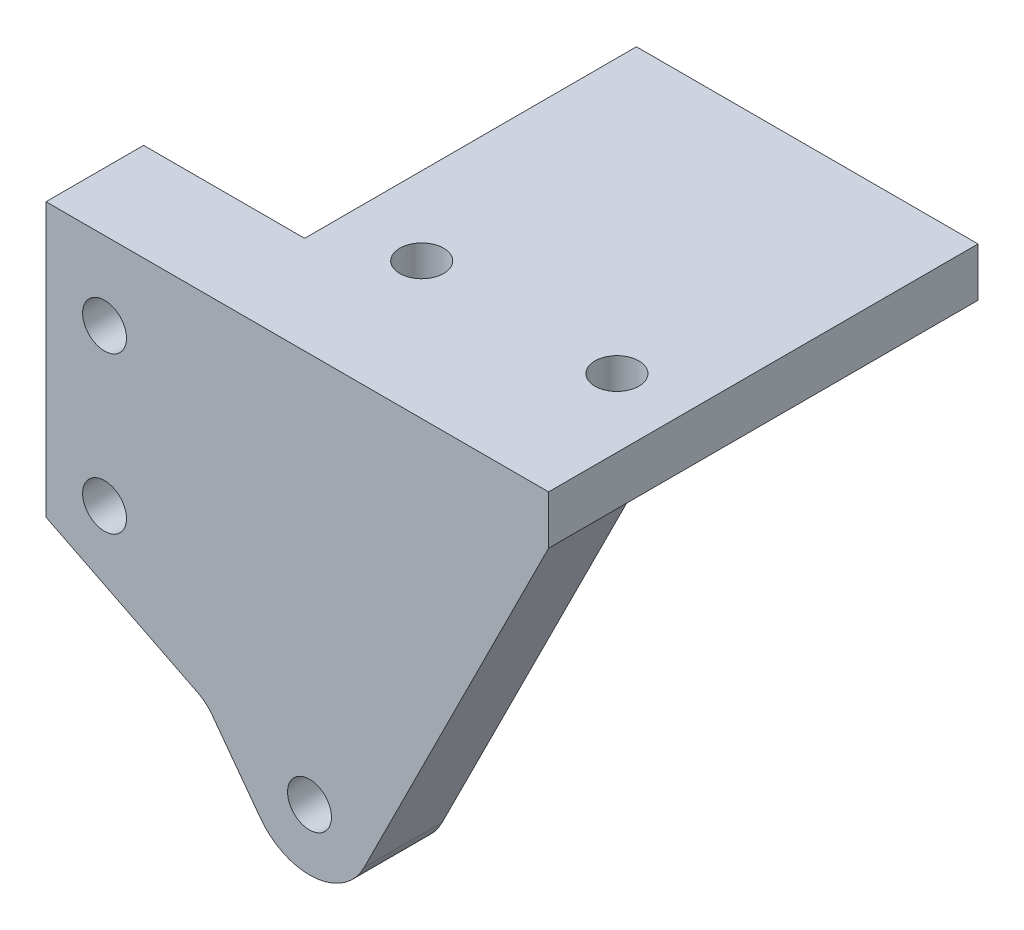
ISO-10303-21;
HEADER;
FILE_DESCRIPTION(('STEP AP214'),'2;1');
FILE_NAME('part.step','',(''),(''),'','','');
FILE_SCHEMA(('AUTOMOTIVE_DESIGN { 1 0 10303 214 1 1 1 1 }'));
ENDSEC;
DATA;
#1=APPLICATION_CONTEXT('core data for automotive mechanical design processes');
#2=APPLICATION_PROTOCOL_DEFINITION('international standard','automotive_design',2000,#1);
#3=PRODUCT_CONTEXT('',#1,'mechanical');
#4=PRODUCT('Part','Part','',(#3));
#5=PRODUCT_RELATED_PRODUCT_CATEGORY('part','',(#4));
#6=PRODUCT_DEFINITION_FORMATION('','',#4);
#7=PRODUCT_DEFINITION_CONTEXT('part definition',#1,'design');
#8=PRODUCT_DEFINITION('design','',#6,#7);
#9=PRODUCT_DEFINITION_SHAPE('','',#8);
#10=(LENGTH_UNIT() NAMED_UNIT(*) SI_UNIT(.MILLI.,.METRE.));
#11=(NAMED_UNIT(*) PLANE_ANGLE_UNIT() SI_UNIT($,.RADIAN.));
#12=(NAMED_UNIT(*) SI_UNIT($,.STERADIAN.) SOLID_ANGLE_UNIT());
#13=UNCERTAINTY_MEASURE_WITH_UNIT(LENGTH_MEASURE(1.E-05),#10,'distance_accuracy_value','');
#14=(GEOMETRIC_REPRESENTATION_CONTEXT(3) GLOBAL_UNCERTAINTY_ASSIGNED_CONTEXT((#13)) GLOBAL_UNIT_ASSIGNED_CONTEXT((#10,
#11,#12)) REPRESENTATION_CONTEXT('',''));
#15=CARTESIAN_POINT('',(0.,0.,0.));
#16=DIRECTION('',(0.,0.,1.));
#17=DIRECTION('',(1.,0.,0.));
#18=AXIS2_PLACEMENT_3D('',#15,#16,#17);
#19=CARTESIAN_POINT('',(0.,28.,0.));
#20=DIRECTION('',(-1.,0.,0.));
#21=DIRECTION('',(0.,0.,1.));
#22=AXIS2_PLACEMENT_3D('',#19,#20,#21);
#23=PLANE('',#22);
#24=CARTESIAN_POINT('',(0.,17.5,-34.));
#25=DIRECTION('',(1.,0.,0.));
#26=DIRECTION('',(0.,0.,-1.));
#27=AXIS2_PLACEMENT_3D('',#24,#25,#26);
#28=CIRCLE('',#27,2.25);
#29=CARTESIAN_POINT('',(0.,17.5,-36.25));
#30=VERTEX_POINT('',#29);
#31=EDGE_CURVE('E269',#30,#30,#28,.T.);
#32=ORIENTED_EDGE('',*,*,#31,.F.);
#33=EDGE_LOOP('',(#32));
#34=FACE_BOUND('',#33,.T.);
#35=DIRECTION('',(0.,-1.,0.));
#36=VECTOR('',#35,1.);
#37=CARTESIAN_POINT('',(0.,23.,-8.));
#38=LINE('',#37,#36);
#39=CARTESIAN_POINT('',(0.,23.,-8.));
#40=VERTEX_POINT('',#39);
#41=CARTESIAN_POINT('',(0.,0.,-8.));
#42=VERTEX_POINT('',#41);
#43=EDGE_CURVE('E330',#40,#42,#38,.T.);
#44=ORIENTED_EDGE('',*,*,#43,.T.);
#45=DIRECTION('',(0.,0.,-1.));
#46=VECTOR('',#45,1.);
#47=CARTESIAN_POINT('',(0.,0.,0.));
#48=LINE('',#47,#46);
#49=CARTESIAN_POINT('',(0.,0.,-40.));
#50=VERTEX_POINT('',#49);
#51=EDGE_CURVE('E302',#42,#50,#48,.T.);
#52=ORIENTED_EDGE('',*,*,#51,.T.);
#53=DIRECTION('',(0.,-1.,0.));
#54=VECTOR('',#53,1.);
#55=CARTESIAN_POINT('',(0.,28.,-40.));
#56=LINE('',#55,#54);
#57=CARTESIAN_POINT('',(0.,23.,-40.));
#58=VERTEX_POINT('',#57);
#59=EDGE_CURVE('E281',#58,#50,#56,.T.);
#60=ORIENTED_EDGE('',*,*,#59,.F.);
#61=DIRECTION('',(0.,0.,-1.));
#62=VECTOR('',#61,1.);
#63=CARTESIAN_POINT('',(0.,23.,0.));
#64=LINE('',#63,#62);
#65=CARTESIAN_POINT('',(0.,23.,-17.5));
#66=VERTEX_POINT('',#65);
#67=EDGE_CURVE('E254',#66,#58,#64,.T.);
#68=ORIENTED_EDGE('',*,*,#67,.F.);
#69=DIRECTION('',(0.,1.,0.));
#70=VECTOR('',#69,1.);
#71=CARTESIAN_POINT('',(0.,23.,-17.5));
#72=LINE('',#71,#70);
#73=CARTESIAN_POINT('',(0.,18.,-17.5));
#74=VERTEX_POINT('',#73);
#75=EDGE_CURVE('E214',#74,#66,#72,.T.);
#76=ORIENTED_EDGE('',*,*,#75,.F.);
#77=DIRECTION('',(0.,0.,-1.));
#78=VECTOR('',#77,1.);
#79=CARTESIAN_POINT('',(0.,18.,-10.5));
#80=LINE('',#79,#78);
#81=CARTESIAN_POINT('',(0.,18.,-15.0307764064044));
#82=VERTEX_POINT('',#81);
#83=EDGE_CURVE('E225',#82,#74,#80,.T.);
#84=ORIENTED_EDGE('',*,*,#83,.F.);
#85=DIRECTION('',(0.,-1.,0.));
#86=VECTOR('',#85,1.);
#87=CARTESIAN_POINT('',(0.,28.00005,-15.0307764064044));
#88=LINE('',#87,#86);
#89=CARTESIAN_POINT('',(0.,13.,-15.0307764064044));
#90=VERTEX_POINT('',#89);
#91=EDGE_CURVE('E249',#82,#90,#88,.T.);
#92=ORIENTED_EDGE('',*,*,#91,.T.);
#93=DIRECTION('',(0.,0.,1.));
#94=VECTOR('',#93,1.);
#95=CARTESIAN_POINT('',(0.,13.,0.));
#96=LINE('',#95,#94);
#97=CARTESIAN_POINT('',(0.,13.,-12.9692235935956));
#98=VERTEX_POINT('',#97);
#99=EDGE_CURVE('E41',#90,#98,#96,.T.);
#100=ORIENTED_EDGE('',*,*,#99,.T.);
#101=DIRECTION('',(0.,-1.,0.));
#102=VECTOR('',#101,1.);
#103=CARTESIAN_POINT('',(0.,28.00005,-12.9692235935956));
#104=LINE('',#103,#102);
#105=CARTESIAN_POINT('',(0.,18.,-12.9692235935956));
#106=VERTEX_POINT('',#105);
#107=EDGE_CURVE('E246',#98,#106,#104,.F.);
#108=ORIENTED_EDGE('',*,*,#107,.T.);
#109=CARTESIAN_POINT('',(0.,18.,-10.5));
#110=VERTEX_POINT('',#109);
#111=EDGE_CURVE('E227',#110,#106,#80,.T.);
#112=ORIENTED_EDGE('',*,*,#111,.F.);
#113=DIRECTION('',(0.,-1.,0.));
#114=VECTOR('',#113,1.);
#115=CARTESIAN_POINT('',(0.,23.,-10.5));
#116=LINE('',#115,#114);
#117=CARTESIAN_POINT('',(0.,23.,-10.5));
#118=VERTEX_POINT('',#117);
#119=EDGE_CURVE('E222',#118,#110,#116,.T.);
#120=ORIENTED_EDGE('',*,*,#119,.F.);
#121=EDGE_CURVE('E259',#40,#118,#64,.T.);
#122=ORIENTED_EDGE('',*,*,#121,.F.);
#123=EDGE_LOOP('',(#44,#52,#60,#68,#76,#84,#92,#100,#108,#112,#120,#122));
#124=FACE_BOUND('',#123,.T.);
#125=ADVANCED_FACE('F33',(#34,#124),#23,.F.);
#126=CARTESIAN_POINT('',(0.,0.,0.));
#127=DIRECTION('',(0.,1.,0.));
#128=DIRECTION('',(0.,0.,1.));
#129=AXIS2_PLACEMENT_3D('',#126,#127,#128);
#130=PLANE('',#129);
#131=DIRECTION('',(-1.,0.,0.));
#132=VECTOR('',#131,1.);
#133=CARTESIAN_POINT('',(0.,0.,-8.));
#134=LINE('',#133,#132);
#135=CARTESIAN_POINT('',(-26.5,0.,-8.));
#136=VERTEX_POINT('',#135);
#137=EDGE_CURVE('E325',#42,#136,#134,.T.);
#138=ORIENTED_EDGE('',*,*,#137,.T.);
#139=DIRECTION('',(0.,0.,1.));
#140=VECTOR('',#139,1.);
#141=CARTESIAN_POINT('',(-26.5,0.,0.));
#142=LINE('',#141,#140);
#143=CARTESIAN_POINT('',(-26.5,0.,-10.));
#144=VERTEX_POINT('',#143);
#145=EDGE_CURVE('E201',#144,#136,#142,.T.);
#146=ORIENTED_EDGE('',*,*,#145,.F.);
#147=DIRECTION('',(-1.,0.,0.));
#148=VECTOR('',#147,1.);
#149=CARTESIAN_POINT('',(-26.5,0.,-10.));
#150=LINE('',#149,#148);
#151=CARTESIAN_POINT('',(-10.,0.,-10.));
#152=VERTEX_POINT('',#151);
#153=EDGE_CURVE('E307',#152,#144,#150,.T.);
#154=ORIENTED_EDGE('',*,*,#153,.F.);
#155=DIRECTION('',(0.,0.,1.));
#156=VECTOR('',#155,1.);
#157=CARTESIAN_POINT('',(-10.,0.,-40.));
#158=LINE('',#157,#156);
#159=CARTESIAN_POINT('',(-10.,0.,-44.));
#160=VERTEX_POINT('',#159);
#161=EDGE_CURVE('E304',#160,#152,#158,.T.);
#162=ORIENTED_EDGE('',*,*,#161,.F.);
#163=DIRECTION('',(-1.,0.,0.));
#164=VECTOR('',#163,1.);
#165=CARTESIAN_POINT('',(0.,0.,-44.));
#166=LINE('',#165,#164);
#167=CARTESIAN_POINT('',(0.,0.,-44.));
#168=VERTEX_POINT('',#167);
#169=EDGE_CURVE('E387',#168,#160,#166,.T.);
#170=ORIENTED_EDGE('',*,*,#169,.F.);
#171=DIRECTION('',(0.,0.,1.));
#172=VECTOR('',#171,1.);
#173=CARTESIAN_POINT('',(0.,0.,-44.));
#174=LINE('',#173,#172);
#175=EDGE_CURVE('E383',#168,#50,#174,.T.);
#176=ORIENTED_EDGE('',*,*,#175,.T.);
#177=ORIENTED_EDGE('',*,*,#51,.F.);
#178=EDGE_LOOP('',(#138,#146,#154,#162,#170,#176,#177));
#179=FACE_BOUND('',#178,.T.);
#180=ADVANCED_FACE('F321',(#179),#130,.F.);
#181=CARTESIAN_POINT('',(25.,23.,0.));
#182=DIRECTION('',(0.,1.,0.));
#183=DIRECTION('',(0.,0.,1.));
#184=AXIS2_PLACEMENT_3D('',#181,#182,#183);
#185=PLANE('',#184);
#186=CARTESIAN_POINT('',(-2.,23.,-14.));
#187=DIRECTION('',(0.,1.,0.));
#188=DIRECTION('',(0.,0.,1.));
#189=AXIS2_PLACEMENT_3D('',#186,#187,#188);
#190=CIRCLE('',#189,2.25);
#191=CARTESIAN_POINT('',(-2.,23.,-11.75));
#192=VERTEX_POINT('',#191);
#193=EDGE_CURVE('E278',#192,#192,#190,.T.);
#194=ORIENTED_EDGE('',*,*,#193,.T.);
#195=EDGE_LOOP('',(#194));
#196=FACE_BOUND('',#195,.T.);
#197=CARTESIAN_POINT('',(18.,23.,-14.));
#198=DIRECTION('',(0.,1.,0.));
#199=DIRECTION('',(0.,0.,1.));
#200=AXIS2_PLACEMENT_3D('',#197,#198,#199);
#201=CIRCLE('',#200,2.25);
#202=CARTESIAN_POINT('',(18.,23.,-11.75));
#203=VERTEX_POINT('',#202);
#204=EDGE_CURVE('E234',#203,#203,#201,.T.);
#205=ORIENTED_EDGE('',*,*,#204,.T.);
#206=EDGE_LOOP('',(#205));
#207=FACE_BOUND('',#206,.T.);
#208=DIRECTION('',(-1.,0.,0.));
#209=VECTOR('',#208,1.);
#210=CARTESIAN_POINT('',(25.,23.,-8.));
#211=LINE('',#210,#209);
#212=CARTESIAN_POINT('',(25.,23.,-8.));
#213=VERTEX_POINT('',#212);
#214=EDGE_CURVE('E334',#213,#40,#211,.T.);
#215=ORIENTED_EDGE('',*,*,#214,.T.);
#216=ORIENTED_EDGE('',*,*,#121,.T.);
#217=DIRECTION('',(1.,0.,0.));
#218=VECTOR('',#217,1.);
#219=CARTESIAN_POINT('',(-10.,23.,-10.5));
#220=LINE('',#219,#218);
#221=CARTESIAN_POINT('',(-10.,23.,-10.5));
#222=VERTEX_POINT('',#221);
#223=EDGE_CURVE('E231',#222,#118,#220,.T.);
#224=ORIENTED_EDGE('',*,*,#223,.F.);
#225=DIRECTION('',(0.,0.,1.));
#226=VECTOR('',#225,1.);
#227=CARTESIAN_POINT('',(-10.,23.,-10.5));
#228=LINE('',#227,#226);
#229=CARTESIAN_POINT('',(-10.,23.,-17.5));
#230=VERTEX_POINT('',#229);
#231=EDGE_CURVE('E218',#230,#222,#228,.T.);
#232=ORIENTED_EDGE('',*,*,#231,.F.);
#233=DIRECTION('',(1.,0.,0.));
#234=VECTOR('',#233,1.);
#235=CARTESIAN_POINT('',(-10.,23.,-17.5));
#236=LINE('',#235,#234);
#237=EDGE_CURVE('E235',#230,#66,#236,.T.);
#238=ORIENTED_EDGE('',*,*,#237,.T.);
#239=ORIENTED_EDGE('',*,*,#67,.T.);
#240=DIRECTION('',(-1.,0.,0.));
#241=VECTOR('',#240,1.);
#242=CARTESIAN_POINT('',(25.,23.,-40.));
#243=LINE('',#242,#241);
#244=CARTESIAN_POINT('',(25.,23.,-40.));
#245=VERTEX_POINT('',#244);
#246=EDGE_CURVE('E266',#245,#58,#243,.T.);
#247=ORIENTED_EDGE('',*,*,#246,.F.);
#248=DIRECTION('',(0.,0.,-1.));
#249=VECTOR('',#248,1.);
#250=CARTESIAN_POINT('',(25.,23.,0.));
#251=LINE('',#250,#249);
#252=EDGE_CURVE('E258',#213,#245,#251,.T.);
#253=ORIENTED_EDGE('',*,*,#252,.F.);
#254=EDGE_LOOP('',(#215,#216,#224,#232,#238,#239,#247,#253));
#255=FACE_BOUND('',#254,.T.);
#256=ADVANCED_FACE('F405',(#196,#207,#255),#185,.F.);
#257=CARTESIAN_POINT('',(-2.,28.00005,-14.));
#258=DIRECTION('',(0.,-1.,0.));
#259=DIRECTION('',(0.,0.,-1.));
#260=AXIS2_PLACEMENT_3D('',#257,#258,#259);
#261=CYLINDRICAL_SURFACE('',#260,2.25);
#262=CARTESIAN_POINT('',(-2.,28.,-14.));
#263=DIRECTION('',(0.,1.,0.));
#264=DIRECTION('',(0.,0.,1.));
#265=AXIS2_PLACEMENT_3D('',#262,#263,#264);
#266=CIRCLE('',#265,2.25);
#267=CARTESIAN_POINT('',(-2.,28.,-11.75));
#268=VERTEX_POINT('',#267);
#269=EDGE_CURVE('E251',#268,#268,#266,.T.);
#270=ORIENTED_EDGE('',*,*,#269,.T.);
#271=EDGE_LOOP('',(#270));
#272=FACE_BOUND('',#271,.T.);
#273=ORIENTED_EDGE('',*,*,#193,.F.);
#274=EDGE_LOOP('',(#273));
#275=FACE_BOUND('',#274,.T.);
#276=ADVANCED_FACE('F475',(#272,#275),#261,.F.);
#277=CARTESIAN_POINT('',(-10.,28.,-40.));
#278=DIRECTION('',(1.,0.,0.));
#279=DIRECTION('',(0.,0.,-1.));
#280=AXIS2_PLACEMENT_3D('',#277,#278,#279);
#281=PLANE('',#280);
#282=ORIENTED_EDGE('',*,*,#231,.T.);
#283=DIRECTION('',(0.,-1.,0.));
#284=VECTOR('',#283,1.);
#285=CARTESIAN_POINT('',(-10.,23.,-10.5));
#286=LINE('',#285,#284);
#287=CARTESIAN_POINT('',(-10.,18.,-10.5));
#288=VERTEX_POINT('',#287);
#289=EDGE_CURVE('E210',#222,#288,#286,.T.);
#290=ORIENTED_EDGE('',*,*,#289,.T.);
#291=DIRECTION('',(0.,0.,-1.));
#292=VECTOR('',#291,1.);
#293=CARTESIAN_POINT('',(-10.,18.,-10.5));
#294=LINE('',#293,#292);
#295=CARTESIAN_POINT('',(-10.,18.,-17.5));
#296=VERTEX_POINT('',#295);
#297=EDGE_CURVE('E213',#288,#296,#294,.T.);
#298=ORIENTED_EDGE('',*,*,#297,.T.);
#299=DIRECTION('',(0.,1.,0.));
#300=VECTOR('',#299,1.);
#301=CARTESIAN_POINT('',(-10.,23.,-17.5));
#302=LINE('',#301,#300);
#303=EDGE_CURVE('E57',#296,#230,#302,.T.);
#304=ORIENTED_EDGE('',*,*,#303,.T.);
#305=EDGE_LOOP('',(#282,#290,#298,#304));
#306=FACE_BOUND('',#305,.T.);
#307=CARTESIAN_POINT('',(-10.,17.5,-34.));
#308=DIRECTION('',(1.,0.,0.));
#309=DIRECTION('',(0.,0.,-1.));
#310=AXIS2_PLACEMENT_3D('',#307,#308,#309);
#311=CIRCLE('',#310,2.25);
#312=CARTESIAN_POINT('',(-10.,17.5,-36.25));
#313=VERTEX_POINT('',#312);
#314=EDGE_CURVE('E290',#313,#313,#311,.T.);
#315=ORIENTED_EDGE('',*,*,#314,.T.);
#316=EDGE_LOOP('',(#315));
#317=FACE_BOUND('',#316,.T.);
#318=ORIENTED_EDGE('',*,*,#161,.T.);
#319=DIRECTION('',(0.,-1.,0.));
#320=VECTOR('',#319,1.);
#321=CARTESIAN_POINT('',(-10.,28.,-10.));
#322=LINE('',#321,#320);
#323=CARTESIAN_POINT('',(-10.,28.,-10.));
#324=VERTEX_POINT('',#323);
#325=EDGE_CURVE('E289',#324,#152,#322,.T.);
#326=ORIENTED_EDGE('',*,*,#325,.F.);
#327=DIRECTION('',(0.,0.,1.));
#328=VECTOR('',#327,1.);
#329=CARTESIAN_POINT('',(-10.,28.,-40.));
#330=LINE('',#329,#328);
#331=CARTESIAN_POINT('',(-10.,28.,-44.));
#332=VERTEX_POINT('',#331);
#333=EDGE_CURVE('E309',#332,#324,#330,.T.);
#334=ORIENTED_EDGE('',*,*,#333,.F.);
#335=DIRECTION('',(0.,1.,0.));
#336=VECTOR('',#335,1.);
#337=CARTESIAN_POINT('',(-10.,0.,-44.));
#338=LINE('',#337,#336);
#339=EDGE_CURVE('E382',#160,#332,#338,.T.);
#340=ORIENTED_EDGE('',*,*,#339,.F.);
#341=EDGE_LOOP('',(#318,#326,#334,#340));
#342=FACE_BOUND('',#341,.T.);
#343=ADVANCED_FACE('F416',(#306,#317,#342),#281,.F.);
#344=CARTESIAN_POINT('',(-26.5,28.,-10.));
#345=DIRECTION('',(0.,0.,1.));
#346=DIRECTION('',(1.,0.,0.));
#347=AXIS2_PLACEMENT_3D('',#344,#345,#346);
#348=PLANE('',#347);
#349=CARTESIAN_POINT('',(-20.5,4.,-10.));
#350=DIRECTION('',(0.,0.,1.));
#351=DIRECTION('',(1.,0.,0.));
#352=AXIS2_PLACEMENT_3D('',#349,#350,#351);
#353=CIRCLE('',#352,2.25);
#354=CARTESIAN_POINT('',(-18.25,4.,-10.));
#355=VERTEX_POINT('',#354);
#356=EDGE_CURVE('E466',#355,#355,#353,.T.);
#357=ORIENTED_EDGE('',*,*,#356,.T.);
#358=EDGE_LOOP('',(#357));
#359=FACE_BOUND('',#358,.T.);
#360=CARTESIAN_POINT('',(-20.5,20.,-10.));
#361=DIRECTION('',(0.,0.,1.));
#362=DIRECTION('',(1.,0.,0.));
#363=AXIS2_PLACEMENT_3D('',#360,#361,#362);
#364=CIRCLE('',#363,2.25);
#365=CARTESIAN_POINT('',(-18.25,20.,-10.));
#366=VERTEX_POINT('',#365);
#367=EDGE_CURVE('E305',#366,#366,#364,.T.);
#368=ORIENTED_EDGE('',*,*,#367,.T.);
#369=EDGE_LOOP('',(#368));
#370=FACE_BOUND('',#369,.T.);
#371=ORIENTED_EDGE('',*,*,#153,.T.);
#372=DIRECTION('',(0.,-1.,0.));
#373=VECTOR('',#372,1.);
#374=CARTESIAN_POINT('',(-26.5,28.,-10.));
#375=LINE('',#374,#373);
#376=CARTESIAN_POINT('',(-26.5,28.,-10.));
#377=VERTEX_POINT('',#376);
#378=EDGE_CURVE('E296',#377,#144,#375,.T.);
#379=ORIENTED_EDGE('',*,*,#378,.F.);
#380=DIRECTION('',(-1.,0.,0.));
#381=VECTOR('',#380,1.);
#382=CARTESIAN_POINT('',(-26.5,28.,-10.));
#383=LINE('',#382,#381);
#384=EDGE_CURVE('E317',#324,#377,#383,.T.);
#385=ORIENTED_EDGE('',*,*,#384,.F.);
#386=ORIENTED_EDGE('',*,*,#325,.T.);
#387=EDGE_LOOP('',(#371,#379,#385,#386));
#388=FACE_BOUND('',#387,.T.);
#389=ADVANCED_FACE('F316',(#359,#370,#388),#348,.F.);
#390=CARTESIAN_POINT('',(-26.5,28.,0.));
#391=DIRECTION('',(1.,0.,0.));
#392=DIRECTION('',(0.,0.,-1.));
#393=AXIS2_PLACEMENT_3D('',#390,#391,#392);
#394=PLANE('',#393);
#395=DIRECTION('',(0.,0.,1.));
#396=VECTOR('',#395,1.);
#397=CARTESIAN_POINT('',(-26.5,0.,-8.));
#398=LINE('',#397,#396);
#399=CARTESIAN_POINT('',(-26.5,0.,0.));
#400=VERTEX_POINT('',#399);
#401=EDGE_CURVE('E190',#136,#400,#398,.T.);
#402=ORIENTED_EDGE('',*,*,#401,.T.);
#403=DIRECTION('',(0.,1.,0.));
#404=VECTOR('',#403,1.);
#405=CARTESIAN_POINT('',(-26.5,28.,0.));
#406=LINE('',#405,#404);
#407=CARTESIAN_POINT('',(-26.5,28.,0.));
#408=VERTEX_POINT('',#407);
#409=EDGE_CURVE('E172',#400,#408,#406,.T.);
#410=ORIENTED_EDGE('',*,*,#409,.T.);
#411=DIRECTION('',(0.,0.,1.));
#412=VECTOR('',#411,1.);
#413=CARTESIAN_POINT('',(-26.5,28.,0.));
#414=LINE('',#413,#412);
#415=EDGE_CURVE('E297',#377,#408,#414,.T.);
#416=ORIENTED_EDGE('',*,*,#415,.F.);
#417=ORIENTED_EDGE('',*,*,#378,.T.);
#418=ORIENTED_EDGE('',*,*,#145,.T.);
#419=EDGE_LOOP('',(#402,#410,#416,#417,#418));
#420=FACE_BOUND('',#419,.T.);
#421=ADVANCED_FACE('F198',(#420),#394,.F.);
#422=CARTESIAN_POINT('',(0.,28.,0.));
#423=DIRECTION('',(0.,0.,-1.));
#424=DIRECTION('',(-1.,0.,0.));
#425=AXIS2_PLACEMENT_3D('',#422,#423,#424);
#426=PLANE('',#425);
#427=ORIENTED_EDGE('',*,*,#409,.F.);
#428=DIRECTION('',(0.894062707627854,-0.447941820808406,0.));
#429=VECTOR('',#428,1.);
#430=CARTESIAN_POINT('',(-26.5,0.,0.));
#431=LINE('',#430,#429);
#432=CARTESIAN_POINT('',(-10.9224930112807,-7.80461681786982,0.));
#433=VERTEX_POINT('',#432);
#434=EDGE_CURVE('E177',#400,#433,#431,.T.);
#435=ORIENTED_EDGE('',*,*,#434,.T.);
#436=CARTESIAN_POINT('',(-12.7142602945144,-11.3808676483812,0.));
#437=DIRECTION('',(0.,0.,-1.));
#438=DIRECTION('',(-1.,0.,0.));
#439=AXIS2_PLACEMENT_3D('',#436,#437,#438);
#440=CIRCLE('',#439,4.);
#441=CARTESIAN_POINT('',(-9.49999999999999,-9.,0.));
#442=VERTEX_POINT('',#441);
#443=EDGE_CURVE('E194',#433,#442,#440,.T.);
#444=ORIENTED_EDGE('',*,*,#443,.T.);
#445=DIRECTION('',(0.595216912095308,-0.803565073628593,0.));
#446=VECTOR('',#445,1.);
#447=CARTESIAN_POINT('',(-9.49999999999999,-9.,0.));
#448=LINE('',#447,#446);
#449=CARTESIAN_POINT('',(-4.5222817101787,-15.7201057005957,0.));
#450=VERTEX_POINT('',#449);
#451=EDGE_CURVE('E349',#442,#450,#448,.T.);
#452=ORIENTED_EDGE('',*,*,#451,.T.);
#453=CARTESIAN_POINT('',(0.500000000000007,-12.,0.));
#454=DIRECTION('',(0.,0.,1.));
#455=DIRECTION('',(1.,0.,0.));
#456=AXIS2_PLACEMENT_3D('',#453,#454,#455);
#457=CIRCLE('',#456,6.25);
#458=CARTESIAN_POINT('',(6.08944289459122,-14.7965385976424,0.));
#459=VERTEX_POINT('',#458);
#460=EDGE_CURVE('E342',#450,#459,#457,.T.);
#461=ORIENTED_EDGE('',*,*,#460,.T.);
#462=DIRECTION('',(0.447446175622787,0.894310863134594,0.));
#463=VECTOR('',#462,1.);
#464=CARTESIAN_POINT('',(6.08944289459122,-14.7965385976424,0.));
#465=LINE('',#464,#463);
#466=CARTESIAN_POINT('',(25.,23.,0.));
#467=VERTEX_POINT('',#466);
#468=EDGE_CURVE('E195',#459,#467,#465,.T.);
#469=ORIENTED_EDGE('',*,*,#468,.T.);
#470=DIRECTION('',(0.,-1.,0.));
#471=VECTOR('',#470,1.);
#472=CARTESIAN_POINT('',(25.,28.,0.));
#473=LINE('',#472,#471);
#474=CARTESIAN_POINT('',(25.,28.,0.));
#475=VERTEX_POINT('',#474);
#476=EDGE_CURVE('E255',#475,#467,#473,.T.);
#477=ORIENTED_EDGE('',*,*,#476,.F.);
#478=DIRECTION('',(1.,0.,0.));
#479=VECTOR('',#478,1.);
#480=CARTESIAN_POINT('',(0.,28.,0.));
#481=LINE('',#480,#479);
#482=EDGE_CURVE('E179',#408,#475,#481,.T.);
#483=ORIENTED_EDGE('',*,*,#482,.F.);
#484=EDGE_LOOP('',(#427,#435,#444,#452,#461,#469,#477,#483));
#485=FACE_BOUND('',#484,.T.);
#486=CARTESIAN_POINT('',(0.500000000000006,-12.,0.));
#487=DIRECTION('',(0.,0.,1.));
#488=DIRECTION('',(1.,0.,0.));
#489=AXIS2_PLACEMENT_3D('',#486,#487,#488);
#490=CIRCLE('',#489,2.25);
#491=CARTESIAN_POINT('',(2.75000000000001,-12.,0.));
#492=VERTEX_POINT('',#491);
#493=EDGE_CURVE('E395',#492,#492,#490,.T.);
#494=ORIENTED_EDGE('',*,*,#493,.F.);
#495=EDGE_LOOP('',(#494));
#496=FACE_BOUND('',#495,.T.);
#497=CARTESIAN_POINT('',(-20.5,20.,0.));
#498=DIRECTION('',(0.,0.,-1.));
#499=DIRECTION('',(-1.,0.,0.));
#500=AXIS2_PLACEMENT_3D('',#497,#498,#499);
#501=CIRCLE('',#500,2.25);
#502=CARTESIAN_POINT('',(-18.25,20.,0.));
#503=VERTEX_POINT('',#502);
#504=EDGE_CURVE('E185',#503,#503,#501,.F.);
#505=ORIENTED_EDGE('',*,*,#504,.F.);
#506=EDGE_LOOP('',(#505));
#507=FACE_BOUND('',#506,.T.);
#508=CARTESIAN_POINT('',(-20.5,4.,0.));
#509=DIRECTION('',(0.,0.,-1.));
#510=DIRECTION('',(-1.,0.,0.));
#511=AXIS2_PLACEMENT_3D('',#508,#509,#510);
#512=CIRCLE('',#511,2.25);
#513=CARTESIAN_POINT('',(-18.25,4.,0.));
#514=VERTEX_POINT('',#513);
#515=EDGE_CURVE('E36',#514,#514,#512,.F.);
#516=ORIENTED_EDGE('',*,*,#515,.F.);
#517=EDGE_LOOP('',(#516));
#518=FACE_BOUND('',#517,.T.);
#519=ADVANCED_FACE('F174',(#485,#496,#507,#518),#426,.F.);
#520=CARTESIAN_POINT('',(0.,28.,0.));
#521=DIRECTION('',(0.,1.,0.));
#522=DIRECTION('',(0.,0.,1.));
#523=AXIS2_PLACEMENT_3D('',#520,#521,#522);
#524=PLANE('',#523);
#525=ORIENTED_EDGE('',*,*,#415,.T.);
#526=ORIENTED_EDGE('',*,*,#482,.T.);
#527=DIRECTION('',(0.,0.,1.));
#528=VECTOR('',#527,1.);
#529=CARTESIAN_POINT('',(25.,28.,0.));
#530=LINE('',#529,#528);
#531=CARTESIAN_POINT('',(25.,28.,-44.));
#532=VERTEX_POINT('',#531);
#533=EDGE_CURVE('E263',#532,#475,#530,.T.);
#534=ORIENTED_EDGE('',*,*,#533,.F.);
#535=DIRECTION('',(1.,0.,0.));
#536=VECTOR('',#535,1.);
#537=CARTESIAN_POINT('',(-10.,28.,-44.));
#538=LINE('',#537,#536);
#539=EDGE_CURVE('E377',#332,#532,#538,.T.);
#540=ORIENTED_EDGE('',*,*,#539,.F.);
#541=ORIENTED_EDGE('',*,*,#333,.T.);
#542=ORIENTED_EDGE('',*,*,#384,.T.);
#543=EDGE_LOOP('',(#525,#526,#534,#540,#541,#542));
#544=FACE_BOUND('',#543,.T.);
#545=CARTESIAN_POINT('',(18.,28.,-14.));
#546=DIRECTION('',(0.,1.,0.));
#547=DIRECTION('',(0.,0.,1.));
#548=AXIS2_PLACEMENT_3D('',#545,#546,#547);
#549=CIRCLE('',#548,2.25);
#550=CARTESIAN_POINT('',(18.,28.,-11.75));
#551=VERTEX_POINT('',#550);
#552=EDGE_CURVE('E240',#551,#551,#549,.T.);
#553=ORIENTED_EDGE('',*,*,#552,.F.);
#554=EDGE_LOOP('',(#553));
#555=FACE_BOUND('',#554,.T.);
#556=ORIENTED_EDGE('',*,*,#269,.F.);
#557=EDGE_LOOP('',(#556));
#558=FACE_BOUND('',#557,.T.);
#559=ADVANCED_FACE('F375',(#544,#555,#558),#524,.T.);
#560=CARTESIAN_POINT('',(-20.5,20.,-40.));
#561=DIRECTION('',(0.,0.,1.));
#562=DIRECTION('',(1.,0.,0.));
#563=AXIS2_PLACEMENT_3D('',#560,#561,#562);
#564=CYLINDRICAL_SURFACE('',#563,2.25);
#565=CARTESIAN_POINT('',(-18.25,20.,0.));
#566=CARTESIAN_POINT('',(-18.25,20.,-0.10416666666666));
#567=CARTESIAN_POINT('',(-18.25,20.,-0.208333333333327));
#568=CARTESIAN_POINT('',(-18.25,20.,-0.41666666666666));
#569=CARTESIAN_POINT('',(-18.25,20.,-0.520833333333327));
#570=CARTESIAN_POINT('',(-18.25,20.,-0.72916666666666));
#571=CARTESIAN_POINT('',(-18.25,20.,-0.833333333333327));
#572=CARTESIAN_POINT('',(-18.25,20.,-1.04166666666666));
#573=CARTESIAN_POINT('',(-18.25,20.,-1.14583333333333));
#574=CARTESIAN_POINT('',(-18.25,20.,-1.35416666666666));
#575=CARTESIAN_POINT('',(-18.25,20.,-1.45833333333333));
#576=CARTESIAN_POINT('',(-18.25,20.,-1.66666666666666));
#577=CARTESIAN_POINT('',(-18.25,20.,-1.77083333333333));
#578=CARTESIAN_POINT('',(-18.25,20.,-1.97916666666666));
#579=CARTESIAN_POINT('',(-18.25,20.,-2.08333333333333));
#580=CARTESIAN_POINT('',(-18.25,20.,-2.29166666666666));
#581=CARTESIAN_POINT('',(-18.25,20.,-2.39583333333333));
#582=CARTESIAN_POINT('',(-18.25,20.,-2.60416666666666));
#583=CARTESIAN_POINT('',(-18.25,20.,-2.70833333333333));
#584=CARTESIAN_POINT('',(-18.25,20.,-2.91666666666666));
#585=CARTESIAN_POINT('',(-18.25,20.,-3.02083333333333));
#586=CARTESIAN_POINT('',(-18.25,20.,-3.22916666666666));
#587=CARTESIAN_POINT('',(-18.25,20.,-3.33333333333333));
#588=CARTESIAN_POINT('',(-18.25,20.,-3.54166666666666));
#589=CARTESIAN_POINT('',(-18.25,20.,-3.64583333333333));
#590=CARTESIAN_POINT('',(-18.25,20.,-3.85416666666666));
#591=CARTESIAN_POINT('',(-18.25,20.,-3.95833333333333));
#592=CARTESIAN_POINT('',(-18.25,20.,-4.16666666666666));
#593=CARTESIAN_POINT('',(-18.25,20.,-4.27083333333333));
#594=CARTESIAN_POINT('',(-18.25,20.,-4.47916666666666));
#595=CARTESIAN_POINT('',(-18.25,20.,-4.58333333333333));
#596=CARTESIAN_POINT('',(-18.25,20.,-4.79166666666666));
#597=CARTESIAN_POINT('',(-18.25,20.,-4.89583333333333));
#598=CARTESIAN_POINT('',(-18.25,20.,-5.10416666666666));
#599=CARTESIAN_POINT('',(-18.25,20.,-5.20833333333333));
#600=CARTESIAN_POINT('',(-18.25,20.,-5.41666666666666));
#601=CARTESIAN_POINT('',(-18.25,20.,-5.52083333333333));
#602=CARTESIAN_POINT('',(-18.25,20.,-5.72916666666666));
#603=CARTESIAN_POINT('',(-18.25,20.,-5.83333333333333));
#604=CARTESIAN_POINT('',(-18.25,20.,-6.04166666666667));
#605=CARTESIAN_POINT('',(-18.25,20.,-6.14583333333333));
#606=CARTESIAN_POINT('',(-18.25,20.,-6.35416666666667));
#607=CARTESIAN_POINT('',(-18.25,20.,-6.45833333333333));
#608=CARTESIAN_POINT('',(-18.25,20.,-6.66666666666667));
#609=CARTESIAN_POINT('',(-18.25,20.,-6.77083333333333));
#610=CARTESIAN_POINT('',(-18.25,20.,-6.97916666666667));
#611=CARTESIAN_POINT('',(-18.25,20.,-7.08333333333333));
#612=CARTESIAN_POINT('',(-18.25,20.,-7.29166666666667));
#613=CARTESIAN_POINT('',(-18.25,20.,-7.39583333333333));
#614=CARTESIAN_POINT('',(-18.25,20.,-7.60416666666667));
#615=CARTESIAN_POINT('',(-18.25,20.,-7.70833333333333));
#616=CARTESIAN_POINT('',(-18.25,20.,-7.91666666666667));
#617=CARTESIAN_POINT('',(-18.25,20.,-8.02083333333333));
#618=CARTESIAN_POINT('',(-18.25,20.,-8.22916666666667));
#619=CARTESIAN_POINT('',(-18.25,20.,-8.33333333333333));
#620=CARTESIAN_POINT('',(-18.25,20.,-8.54166666666667));
#621=CARTESIAN_POINT('',(-18.25,20.,-8.64583333333333));
#622=CARTESIAN_POINT('',(-18.25,20.,-8.85416666666667));
#623=CARTESIAN_POINT('',(-18.25,20.,-8.95833333333333));
#624=CARTESIAN_POINT('',(-18.25,20.,-9.16666666666666));
#625=CARTESIAN_POINT('',(-18.25,20.,-9.27083333333333));
#626=CARTESIAN_POINT('',(-18.25,20.,-9.47916666666667));
#627=CARTESIAN_POINT('',(-18.25,20.,-9.58333333333333));
#628=CARTESIAN_POINT('',(-18.25,20.,-9.79166666666667));
#629=CARTESIAN_POINT('',(-18.25,20.,-9.89583333333333));
#630=CARTESIAN_POINT('',(-18.25,20.,-10.));
#631=B_SPLINE_CURVE_WITH_KNOTS('',3,(#565,#566,#567,#568,#569,#570,#571,#572,#573,#574,#575,
#576,#577,#578,#579,#580,#581,#582,#583,#584,#585,#586,#587,#588,#589,#590,#591,#592,#593,#594,
#595,#596,#597,#598,#599,#600,#601,#602,#603,#604,#605,#606,#607,#608,#609,#610,#611,#612,#613,
#614,#615,#616,#617,#618,#619,#620,#621,#622,#623,#624,#625,#626,#627,#628,#629,#630),
.UNSPECIFIED.,.F.,.F.,(4,2,2,2,2,2,2,2,2,2,2,2,2,2,2,2,2,2,2,2,2,2,2,2,2,2,2,2,2,2,2,2,4),(0.,
0.3125,0.625000000000001,0.937500000000001,1.25,1.5625,1.875,2.1875,2.5,2.8125,3.125,3.4375,
3.75,4.0625,4.375,4.6875,5.,5.3125,5.62500000000001,5.93750000000001,6.25000000000001,
6.56250000000001,6.87500000000001,7.18750000000001,7.50000000000001,7.81250000000001,
8.12500000000001,8.43750000000001,8.75000000000001,9.06250000000001,9.37500000000001,
9.68750000000001,10.),.UNSPECIFIED.);
#632=EDGE_CURVE('BSEAM451',#503,#366,#631,.T.);
#633=ORIENTED_EDGE('',*,*,#504,.T.);
#634=ORIENTED_EDGE('',*,*,#367,.F.);
#635=ORIENTED_EDGE('',*,*,#632,.T.);
#636=ORIENTED_EDGE('',*,*,#632,.F.);
#637=EDGE_LOOP('',(#633,#635,#634,#636));
#638=FACE_BOUND('',#637,.T.);
#639=ADVANCED_FACE('F451',(#638),#564,.F.);
#640=CARTESIAN_POINT('',(-20.5,4.,-40.));
#641=DIRECTION('',(0.,0.,1.));
#642=DIRECTION('',(1.,0.,0.));
#643=AXIS2_PLACEMENT_3D('',#640,#641,#642);
#644=CYLINDRICAL_SURFACE('',#643,2.25);
#645=CARTESIAN_POINT('',(-18.25,4.,0.));
#646=CARTESIAN_POINT('',(-18.25,4.,-0.10416666666666));
#647=CARTESIAN_POINT('',(-18.25,4.,-0.208333333333327));
#648=CARTESIAN_POINT('',(-18.25,4.,-0.41666666666666));
#649=CARTESIAN_POINT('',(-18.25,4.,-0.520833333333327));
#650=CARTESIAN_POINT('',(-18.25,4.,-0.72916666666666));
#651=CARTESIAN_POINT('',(-18.25,4.,-0.833333333333327));
#652=CARTESIAN_POINT('',(-18.25,4.,-1.04166666666666));
#653=CARTESIAN_POINT('',(-18.25,4.,-1.14583333333333));
#654=CARTESIAN_POINT('',(-18.25,4.,-1.35416666666666));
#655=CARTESIAN_POINT('',(-18.25,4.,-1.45833333333333));
#656=CARTESIAN_POINT('',(-18.25,4.,-1.66666666666666));
#657=CARTESIAN_POINT('',(-18.25,4.,-1.77083333333333));
#658=CARTESIAN_POINT('',(-18.25,4.,-1.97916666666666));
#659=CARTESIAN_POINT('',(-18.25,4.,-2.08333333333333));
#660=CARTESIAN_POINT('',(-18.25,4.,-2.29166666666666));
#661=CARTESIAN_POINT('',(-18.25,4.,-2.39583333333333));
#662=CARTESIAN_POINT('',(-18.25,4.,-2.60416666666666));
#663=CARTESIAN_POINT('',(-18.25,4.,-2.70833333333333));
#664=CARTESIAN_POINT('',(-18.25,4.,-2.91666666666666));
#665=CARTESIAN_POINT('',(-18.25,4.,-3.02083333333333));
#666=CARTESIAN_POINT('',(-18.25,4.,-3.22916666666666));
#667=CARTESIAN_POINT('',(-18.25,4.,-3.33333333333333));
#668=CARTESIAN_POINT('',(-18.25,4.,-3.54166666666666));
#669=CARTESIAN_POINT('',(-18.25,4.,-3.64583333333333));
#670=CARTESIAN_POINT('',(-18.25,4.,-3.85416666666666));
#671=CARTESIAN_POINT('',(-18.25,4.,-3.95833333333333));
#672=CARTESIAN_POINT('',(-18.25,4.,-4.16666666666666));
#673=CARTESIAN_POINT('',(-18.25,4.,-4.27083333333333));
#674=CARTESIAN_POINT('',(-18.25,4.,-4.47916666666666));
#675=CARTESIAN_POINT('',(-18.25,4.,-4.58333333333333));
#676=CARTESIAN_POINT('',(-18.25,4.,-4.79166666666666));
#677=CARTESIAN_POINT('',(-18.25,4.,-4.89583333333333));
#678=CARTESIAN_POINT('',(-18.25,4.,-5.10416666666666));
#679=CARTESIAN_POINT('',(-18.25,4.,-5.20833333333333));
#680=CARTESIAN_POINT('',(-18.25,4.,-5.41666666666666));
#681=CARTESIAN_POINT('',(-18.25,4.,-5.52083333333333));
#682=CARTESIAN_POINT('',(-18.25,4.,-5.72916666666666));
#683=CARTESIAN_POINT('',(-18.25,4.,-5.83333333333333));
#684=CARTESIAN_POINT('',(-18.25,4.,-6.04166666666667));
#685=CARTESIAN_POINT('',(-18.25,4.,-6.14583333333333));
#686=CARTESIAN_POINT('',(-18.25,4.,-6.35416666666667));
#687=CARTESIAN_POINT('',(-18.25,4.,-6.45833333333333));
#688=CARTESIAN_POINT('',(-18.25,4.,-6.66666666666667));
#689=CARTESIAN_POINT('',(-18.25,4.,-6.77083333333333));
#690=CARTESIAN_POINT('',(-18.25,4.,-6.97916666666667));
#691=CARTESIAN_POINT('',(-18.25,4.,-7.08333333333333));
#692=CARTESIAN_POINT('',(-18.25,4.,-7.29166666666667));
#693=CARTESIAN_POINT('',(-18.25,4.,-7.39583333333333));
#694=CARTESIAN_POINT('',(-18.25,4.,-7.60416666666667));
#695=CARTESIAN_POINT('',(-18.25,4.,-7.70833333333333));
#696=CARTESIAN_POINT('',(-18.25,4.,-7.91666666666667));
#697=CARTESIAN_POINT('',(-18.25,4.,-8.02083333333333));
#698=CARTESIAN_POINT('',(-18.25,4.,-8.22916666666667));
#699=CARTESIAN_POINT('',(-18.25,4.,-8.33333333333333));
#700=CARTESIAN_POINT('',(-18.25,4.,-8.54166666666667));
#701=CARTESIAN_POINT('',(-18.25,4.,-8.64583333333333));
#702=CARTESIAN_POINT('',(-18.25,4.,-8.85416666666667));
#703=CARTESIAN_POINT('',(-18.25,4.,-8.95833333333333));
#704=CARTESIAN_POINT('',(-18.25,4.,-9.16666666666666));
#705=CARTESIAN_POINT('',(-18.25,4.,-9.27083333333333));
#706=CARTESIAN_POINT('',(-18.25,4.,-9.47916666666667));
#707=CARTESIAN_POINT('',(-18.25,4.,-9.58333333333333));
#708=CARTESIAN_POINT('',(-18.25,4.,-9.79166666666667));
#709=CARTESIAN_POINT('',(-18.25,4.,-9.89583333333333));
#710=CARTESIAN_POINT('',(-18.25,4.,-10.));
#711=B_SPLINE_CURVE_WITH_KNOTS('',3,(#645,#646,#647,#648,#649,#650,#651,#652,#653,#654,#655,
#656,#657,#658,#659,#660,#661,#662,#663,#664,#665,#666,#667,#668,#669,#670,#671,#672,#673,#674,
#675,#676,#677,#678,#679,#680,#681,#682,#683,#684,#685,#686,#687,#688,#689,#690,#691,#692,#693,
#694,#695,#696,#697,#698,#699,#700,#701,#702,#703,#704,#705,#706,#707,#708,#709,#710),
.UNSPECIFIED.,.F.,.F.,(4,2,2,2,2,2,2,2,2,2,2,2,2,2,2,2,2,2,2,2,2,2,2,2,2,2,2,2,2,2,2,2,4),(0.,
0.3125,0.625000000000001,0.937500000000001,1.25,1.5625,1.875,2.1875,2.5,2.8125,3.125,3.4375,
3.75,4.0625,4.375,4.6875,5.,5.3125,5.62500000000001,5.93750000000001,6.25000000000001,
6.56250000000001,6.87500000000001,7.18750000000001,7.50000000000001,7.81250000000001,
8.12500000000001,8.43750000000001,8.75000000000001,9.06250000000001,9.37500000000001,
9.68750000000001,10.),.UNSPECIFIED.);
#712=EDGE_CURVE('BSEAM442',#514,#355,#711,.T.);
#713=ORIENTED_EDGE('',*,*,#515,.T.);
#714=ORIENTED_EDGE('',*,*,#356,.F.);
#715=ORIENTED_EDGE('',*,*,#712,.T.);
#716=ORIENTED_EDGE('',*,*,#712,.F.);
#717=EDGE_LOOP('',(#713,#715,#714,#716));
#718=FACE_BOUND('',#717,.T.);
#719=ADVANCED_FACE('F442',(#718),#644,.F.);
#720=CARTESIAN_POINT('',(-26.5,17.5,-34.));
#721=DIRECTION('',(1.,0.,0.));
#722=DIRECTION('',(0.,0.,-1.));
#723=AXIS2_PLACEMENT_3D('',#720,#721,#722);
#724=CYLINDRICAL_SURFACE('',#723,2.25);
#725=ORIENTED_EDGE('',*,*,#31,.T.);
#726=EDGE_LOOP('',(#725));
#727=FACE_BOUND('',#726,.T.);
#728=ORIENTED_EDGE('',*,*,#314,.F.);
#729=EDGE_LOOP('',(#728));
#730=FACE_BOUND('',#729,.T.);
#731=ADVANCED_FACE('F508',(#727,#730),#724,.F.);
#732=CARTESIAN_POINT('',(25.,0.,0.));
#733=DIRECTION('',(1.,0.,0.));
#734=DIRECTION('',(0.,0.,-1.));
#735=AXIS2_PLACEMENT_3D('',#732,#733,#734);
#736=PLANE('',#735);
#737=ORIENTED_EDGE('',*,*,#476,.T.);
#738=EDGE_CURVE('E260',#467,#213,#251,.T.);
#739=ORIENTED_EDGE('',*,*,#738,.T.);
#740=ORIENTED_EDGE('',*,*,#252,.T.);
#741=DIRECTION('',(0.,0.,1.));
#742=VECTOR('',#741,1.);
#743=CARTESIAN_POINT('',(25.,23.,-44.));
#744=LINE('',#743,#742);
#745=CARTESIAN_POINT('',(25.,23.,-44.));
#746=VERTEX_POINT('',#745);
#747=EDGE_CURVE('E385',#746,#245,#744,.T.);
#748=ORIENTED_EDGE('',*,*,#747,.F.);
#749=DIRECTION('',(0.,-1.,0.));
#750=VECTOR('',#749,1.);
#751=CARTESIAN_POINT('',(25.,28.,-44.));
#752=LINE('',#751,#750);
#753=EDGE_CURVE('E371',#532,#746,#752,.T.);
#754=ORIENTED_EDGE('',*,*,#753,.F.);
#755=ORIENTED_EDGE('',*,*,#533,.T.);
#756=EDGE_LOOP('',(#737,#739,#740,#748,#754,#755));
#757=FACE_BOUND('',#756,.T.);
#758=ADVANCED_FACE('F367',(#757),#736,.T.);
#759=CARTESIAN_POINT('',(-2.,13.,-14.));
#760=DIRECTION('',(0.,-1.,0.));
#761=DIRECTION('',(0.,0.,-1.));
#762=AXIS2_PLACEMENT_3D('',#759,#760,#761);
#763=PLANE('',#762);
#764=CARTESIAN_POINT('',(-2.,13.,-14.));
#765=DIRECTION('',(0.,-1.,0.));
#766=DIRECTION('',(0.,0.,-1.));
#767=AXIS2_PLACEMENT_3D('',#764,#765,#766);
#768=CIRCLE('',#767,2.25);
#769=EDGE_CURVE('E243',#98,#90,#768,.T.);
#770=ORIENTED_EDGE('',*,*,#769,.F.);
#771=ORIENTED_EDGE('',*,*,#99,.F.);
#772=EDGE_LOOP('',(#770,#771));
#773=FACE_BOUND('',#772,.T.);
#774=ADVANCED_FACE('F494',(#773),#763,.F.);
#775=ORIENTED_EDGE('',*,*,#91,.F.);
#776=CARTESIAN_POINT('',(-2.,18.,-14.));
#777=DIRECTION('',(0.,-1.,0.));
#778=DIRECTION('',(0.,0.,-1.));
#779=AXIS2_PLACEMENT_3D('',#776,#777,#778);
#780=CIRCLE('',#779,2.25);
#781=EDGE_CURVE('E11',#82,#106,#780,.F.);
#782=ORIENTED_EDGE('',*,*,#781,.T.);
#783=ORIENTED_EDGE('',*,*,#107,.F.);
#784=ORIENTED_EDGE('',*,*,#769,.T.);
#785=EDGE_LOOP('',(#775,#782,#783,#784));
#786=FACE_BOUND('',#785,.T.);
#787=ADVANCED_FACE('F483',(#786),#261,.F.);
#788=CARTESIAN_POINT('',(18.,28.00005,-14.));
#789=DIRECTION('',(0.,-1.,0.));
#790=DIRECTION('',(0.,0.,-1.));
#791=AXIS2_PLACEMENT_3D('',#788,#789,#790);
#792=CYLINDRICAL_SURFACE('',#791,2.25);
#793=ORIENTED_EDGE('',*,*,#552,.T.);
#794=EDGE_LOOP('',(#793));
#795=FACE_BOUND('',#794,.T.);
#796=ORIENTED_EDGE('',*,*,#204,.F.);
#797=EDGE_LOOP('',(#796));
#798=FACE_BOUND('',#797,.T.);
#799=ADVANCED_FACE('F493',(#795,#798),#792,.F.);
#800=CARTESIAN_POINT('',(-10.,18.,-10.5));
#801=DIRECTION('',(0.,-1.,0.));
#802=DIRECTION('',(0.,0.,-1.));
#803=AXIS2_PLACEMENT_3D('',#800,#801,#802);
#804=PLANE('',#803);
#805=ORIENTED_EDGE('',*,*,#83,.T.);
#806=DIRECTION('',(1.,0.,0.));
#807=VECTOR('',#806,1.);
#808=CARTESIAN_POINT('',(-10.,18.,-17.5));
#809=LINE('',#808,#807);
#810=EDGE_CURVE('E237',#296,#74,#809,.T.);
#811=ORIENTED_EDGE('',*,*,#810,.F.);
#812=ORIENTED_EDGE('',*,*,#297,.F.);
#813=DIRECTION('',(1.,0.,0.));
#814=VECTOR('',#813,1.);
#815=CARTESIAN_POINT('',(-10.,18.,-10.5));
#816=LINE('',#815,#814);
#817=EDGE_CURVE('E221',#288,#110,#816,.T.);
#818=ORIENTED_EDGE('',*,*,#817,.T.);
#819=ORIENTED_EDGE('',*,*,#111,.T.);
#820=ORIENTED_EDGE('',*,*,#781,.F.);
#821=EDGE_LOOP('',(#805,#811,#812,#818,#819,#820));
#822=FACE_BOUND('',#821,.T.);
#823=ADVANCED_FACE('F419',(#822),#804,.F.);
#824=CARTESIAN_POINT('',(-10.,23.,-10.5));
#825=DIRECTION('',(0.,0.,1.));
#826=DIRECTION('',(1.,0.,0.));
#827=AXIS2_PLACEMENT_3D('',#824,#825,#826);
#828=PLANE('',#827);
#829=ORIENTED_EDGE('',*,*,#119,.T.);
#830=ORIENTED_EDGE('',*,*,#817,.F.);
#831=ORIENTED_EDGE('',*,*,#289,.F.);
#832=ORIENTED_EDGE('',*,*,#223,.T.);
#833=EDGE_LOOP('',(#829,#830,#831,#832));
#834=FACE_BOUND('',#833,.T.);
#835=ADVANCED_FACE('F411',(#834),#828,.F.);
#836=CARTESIAN_POINT('',(-10.,23.,-17.5));
#837=DIRECTION('',(0.,0.,-1.));
#838=DIRECTION('',(-1.,0.,0.));
#839=AXIS2_PLACEMENT_3D('',#836,#837,#838);
#840=PLANE('',#839);
#841=ORIENTED_EDGE('',*,*,#75,.T.);
#842=ORIENTED_EDGE('',*,*,#237,.F.);
#843=ORIENTED_EDGE('',*,*,#303,.F.);
#844=ORIENTED_EDGE('',*,*,#810,.T.);
#845=EDGE_LOOP('',(#841,#842,#843,#844));
#846=FACE_BOUND('',#845,.T.);
#847=ADVANCED_FACE('F422',(#846),#840,.F.);
#848=CARTESIAN_POINT('',(0.500000000000007,-12.,-8.));
#849=DIRECTION('',(0.,0.,1.));
#850=DIRECTION('',(1.,0.,0.));
#851=AXIS2_PLACEMENT_3D('',#848,#849,#850);
#852=CYLINDRICAL_SURFACE('',#851,6.25);
#853=ORIENTED_EDGE('',*,*,#460,.F.);
#854=DIRECTION('',(0.,0.,1.));
#855=VECTOR('',#854,1.);
#856=CARTESIAN_POINT('',(-4.5222817101787,-15.7201057005957,-8.));
#857=LINE('',#856,#855);
#858=CARTESIAN_POINT('',(-4.5222817101787,-15.7201057005957,-8.));
#859=VERTEX_POINT('',#858);
#860=EDGE_CURVE('E226',#859,#450,#857,.T.);
#861=ORIENTED_EDGE('',*,*,#860,.F.);
#862=CARTESIAN_POINT('',(0.500000000000007,-12.,-8.));
#863=DIRECTION('',(0.,0.,1.));
#864=DIRECTION('',(1.,0.,0.));
#865=AXIS2_PLACEMENT_3D('',#862,#863,#864);
#866=CIRCLE('',#865,6.25);
#867=CARTESIAN_POINT('',(6.08944289459122,-14.7965385976424,-8.));
#868=VERTEX_POINT('',#867);
#869=EDGE_CURVE('E352',#859,#868,#866,.T.);
#870=ORIENTED_EDGE('',*,*,#869,.T.);
#871=DIRECTION('',(0.,0.,1.));
#872=VECTOR('',#871,1.);
#873=CARTESIAN_POINT('',(6.08944289459122,-14.7965385976424,-8.));
#874=LINE('',#873,#872);
#875=EDGE_CURVE('E202',#868,#459,#874,.T.);
#876=ORIENTED_EDGE('',*,*,#875,.T.);
#877=EDGE_LOOP('',(#853,#861,#870,#876));
#878=FACE_BOUND('',#877,.T.);
#879=ADVANCED_FACE('F364',(#878),#852,.T.);
#880=CARTESIAN_POINT('',(-9.49999999999999,-9.,-8.));
#881=DIRECTION('',(-0.803565073628593,-0.595216912095308,0.));
#882=DIRECTION('',(0.595216912095308,-0.803565073628593,0.));
#883=AXIS2_PLACEMENT_3D('',#880,#881,#882);
#884=PLANE('',#883);
#885=ORIENTED_EDGE('',*,*,#451,.F.);
#886=DIRECTION('',(0.,0.,1.));
#887=VECTOR('',#886,1.);
#888=CARTESIAN_POINT('',(-9.49999999999999,-9.,-8.));
#889=LINE('',#888,#887);
#890=CARTESIAN_POINT('',(-9.49999999999999,-9.,-8.));
#891=VERTEX_POINT('',#890);
#892=EDGE_CURVE('E204',#891,#442,#889,.T.);
#893=ORIENTED_EDGE('',*,*,#892,.F.);
#894=DIRECTION('',(0.595216912095308,-0.803565073628593,0.));
#895=VECTOR('',#894,1.);
#896=CARTESIAN_POINT('',(-9.49999999999999,-9.,-8.));
#897=LINE('',#896,#895);
#898=EDGE_CURVE('E206',#891,#859,#897,.T.);
#899=ORIENTED_EDGE('',*,*,#898,.T.);
#900=ORIENTED_EDGE('',*,*,#860,.T.);
#901=EDGE_LOOP('',(#885,#893,#899,#900));
#902=FACE_BOUND('',#901,.T.);
#903=ADVANCED_FACE('F359',(#902),#884,.T.);
#904=CARTESIAN_POINT('',(-12.7142602945144,-11.3808676483812,-8.));
#905=DIRECTION('',(0.,0.,1.));
#906=DIRECTION('',(1.,0.,0.));
#907=AXIS2_PLACEMENT_3D('',#904,#905,#906);
#908=CYLINDRICAL_SURFACE('',#907,4.);
#909=ORIENTED_EDGE('',*,*,#443,.F.);
#910=DIRECTION('',(0.,0.,1.));
#911=VECTOR('',#910,1.);
#912=CARTESIAN_POINT('',(-10.9224930112807,-7.80461681786982,-8.));
#913=LINE('',#912,#911);
#914=CARTESIAN_POINT('',(-10.9224930112807,-7.80461681786982,-8.));
#915=VERTEX_POINT('',#914);
#916=EDGE_CURVE('E192',#915,#433,#913,.T.);
#917=ORIENTED_EDGE('',*,*,#916,.F.);
#918=CARTESIAN_POINT('',(-12.7142602945144,-11.3808676483812,-8.));
#919=DIRECTION('',(0.,0.,-1.));
#920=DIRECTION('',(-1.,0.,0.));
#921=AXIS2_PLACEMENT_3D('',#918,#919,#920);
#922=CIRCLE('',#921,4.);
#923=EDGE_CURVE('E332',#915,#891,#922,.T.);
#924=ORIENTED_EDGE('',*,*,#923,.T.);
#925=ORIENTED_EDGE('',*,*,#892,.T.);
#926=EDGE_LOOP('',(#909,#917,#924,#925));
#927=FACE_BOUND('',#926,.T.);
#928=ADVANCED_FACE('F354',(#927),#908,.F.);
#929=CARTESIAN_POINT('',(-26.5,0.,-8.));
#930=DIRECTION('',(-0.447941820808406,-0.894062707627854,0.));
#931=DIRECTION('',(0.894062707627854,-0.447941820808406,0.));
#932=AXIS2_PLACEMENT_3D('',#929,#930,#931);
#933=PLANE('',#932);
#934=ORIENTED_EDGE('',*,*,#434,.F.);
#935=ORIENTED_EDGE('',*,*,#401,.F.);
#936=DIRECTION('',(0.894062707627854,-0.447941820808406,0.));
#937=VECTOR('',#936,1.);
#938=CARTESIAN_POINT('',(-26.5,0.,-8.));
#939=LINE('',#938,#937);
#940=EDGE_CURVE('E329',#136,#915,#939,.T.);
#941=ORIENTED_EDGE('',*,*,#940,.T.);
#942=ORIENTED_EDGE('',*,*,#916,.T.);
#943=EDGE_LOOP('',(#934,#935,#941,#942));
#944=FACE_BOUND('',#943,.T.);
#945=ADVANCED_FACE('F188',(#944),#933,.T.);
#946=CARTESIAN_POINT('',(6.08944289459122,-14.7965385976424,-8.));
#947=DIRECTION('',(0.894310863134594,-0.447446175622787,0.));
#948=DIRECTION('',(0.447446175622787,0.894310863134594,0.));
#949=AXIS2_PLACEMENT_3D('',#946,#947,#948);
#950=PLANE('',#949);
#951=ORIENTED_EDGE('',*,*,#468,.F.);
#952=ORIENTED_EDGE('',*,*,#875,.F.);
#953=DIRECTION('',(0.447446175622787,0.894310863134594,0.));
#954=VECTOR('',#953,1.);
#955=CARTESIAN_POINT('',(6.08944289459122,-14.7965385976424,-8.));
#956=LINE('',#955,#954);
#957=EDGE_CURVE('E49',#868,#213,#956,.T.);
#958=ORIENTED_EDGE('',*,*,#957,.T.);
#959=ORIENTED_EDGE('',*,*,#738,.F.);
#960=EDGE_LOOP('',(#951,#952,#958,#959));
#961=FACE_BOUND('',#960,.T.);
#962=ADVANCED_FACE('F518',(#961),#950,.T.);
#963=CARTESIAN_POINT('',(0.500000000000007,-12.,-8.));
#964=DIRECTION('',(0.,0.,1.));
#965=DIRECTION('',(1.,0.,0.));
#966=AXIS2_PLACEMENT_3D('',#963,#964,#965);
#967=PLANE('',#966);
#968=CARTESIAN_POINT('',(0.500000000000006,-12.,-8.));
#969=DIRECTION('',(0.,0.,1.));
#970=DIRECTION('',(1.,0.,0.));
#971=AXIS2_PLACEMENT_3D('',#968,#969,#970);
#972=CIRCLE('',#971,2.25);
#973=CARTESIAN_POINT('',(2.75000000000001,-12.,-8.));
#974=VERTEX_POINT('',#973);
#975=EDGE_CURVE('E345',#974,#974,#972,.T.);
#976=ORIENTED_EDGE('',*,*,#975,.T.);
#977=EDGE_LOOP('',(#976));
#978=FACE_BOUND('',#977,.T.);
#979=ORIENTED_EDGE('',*,*,#869,.F.);
#980=ORIENTED_EDGE('',*,*,#898,.F.);
#981=ORIENTED_EDGE('',*,*,#923,.F.);
#982=ORIENTED_EDGE('',*,*,#940,.F.);
#983=ORIENTED_EDGE('',*,*,#137,.F.);
#984=ORIENTED_EDGE('',*,*,#43,.F.);
#985=ORIENTED_EDGE('',*,*,#214,.F.);
#986=ORIENTED_EDGE('',*,*,#957,.F.);
#987=EDGE_LOOP('',(#979,#980,#981,#982,#983,#984,#985,#986));
#988=FACE_BOUND('',#987,.T.);
#989=ADVANCED_FACE('F521',(#978,#988),#967,.F.);
#990=CARTESIAN_POINT('',(0.500000000000006,-12.,-8.));
#991=DIRECTION('',(0.,0.,1.));
#992=DIRECTION('',(1.,0.,0.));
#993=AXIS2_PLACEMENT_3D('',#990,#991,#992);
#994=CYLINDRICAL_SURFACE('',#993,2.25);
#995=ORIENTED_EDGE('',*,*,#975,.F.);
#996=EDGE_LOOP('',(#995));
#997=FACE_BOUND('',#996,.T.);
#998=ORIENTED_EDGE('',*,*,#493,.T.);
#999=EDGE_LOOP('',(#998));
#1000=FACE_BOUND('',#999,.T.);
#1001=ADVANCED_FACE('F530',(#997,#1000),#994,.F.);
#1002=CARTESIAN_POINT('',(0.,0.,-40.));
#1003=DIRECTION('',(0.,0.,-1.));
#1004=DIRECTION('',(-1.,0.,0.));
#1005=AXIS2_PLACEMENT_3D('',#1002,#1003,#1004);
#1006=PLANE('',#1005);
#1007=DIRECTION('',(-0.73593101176183,-0.677056530820883,0.));
#1008=VECTOR('',#1007,1.);
#1009=CARTESIAN_POINT('',(25.,23.,-40.));
#1010=LINE('',#1009,#1008);
#1011=EDGE_CURVE('E184',#245,#50,#1010,.T.);
#1012=ORIENTED_EDGE('',*,*,#1011,.F.);
#1013=ORIENTED_EDGE('',*,*,#246,.T.);
#1014=ORIENTED_EDGE('',*,*,#59,.T.);
#1015=EDGE_LOOP('',(#1012,#1013,#1014));
#1016=FACE_BOUND('',#1015,.T.);
#1017=ADVANCED_FACE('F428',(#1016),#1006,.F.);
#1018=CARTESIAN_POINT('',(25.,23.,-44.));
#1019=DIRECTION('',(-0.677056530820883,0.73593101176183,0.));
#1020=DIRECTION('',(-0.73593101176183,-0.677056530820883,0.));
#1021=AXIS2_PLACEMENT_3D('',#1018,#1019,#1020);
#1022=PLANE('',#1021);
#1023=ORIENTED_EDGE('',*,*,#1011,.T.);
#1024=ORIENTED_EDGE('',*,*,#175,.F.);
#1025=DIRECTION('',(-0.73593101176183,-0.677056530820883,0.));
#1026=VECTOR('',#1025,1.);
#1027=CARTESIAN_POINT('',(25.,23.,-44.));
#1028=LINE('',#1027,#1026);
#1029=EDGE_CURVE('E432',#746,#168,#1028,.T.);
#1030=ORIENTED_EDGE('',*,*,#1029,.F.);
#1031=ORIENTED_EDGE('',*,*,#747,.T.);
#1032=EDGE_LOOP('',(#1023,#1024,#1030,#1031));
#1033=FACE_BOUND('',#1032,.T.);
#1034=ADVANCED_FACE('F431',(#1033),#1022,.F.);
#1035=CARTESIAN_POINT('',(0.,0.,-44.));
#1036=DIRECTION('',(0.,0.,-1.));
#1037=DIRECTION('',(-1.,0.,0.));
#1038=AXIS2_PLACEMENT_3D('',#1035,#1036,#1037);
#1039=PLANE('',#1038);
#1040=ORIENTED_EDGE('',*,*,#753,.T.);
#1041=ORIENTED_EDGE('',*,*,#1029,.T.);
#1042=ORIENTED_EDGE('',*,*,#169,.T.);
#1043=ORIENTED_EDGE('',*,*,#339,.T.);
#1044=ORIENTED_EDGE('',*,*,#539,.T.);
#1045=EDGE_LOOP('',(#1040,#1041,#1042,#1043,#1044));
#1046=FACE_BOUND('',#1045,.T.);
#1047=ADVANCED_FACE('F380',(#1046),#1039,.T.);
#1048=CLOSED_SHELL('',(#125,#180,#256,#276,#343,#389,#421,#519,#559,#639,#719,#731,#758,#774,
#787,#799,#823,#835,#847,#879,#903,#928,#945,#962,#989,#1001,#1017,#1034,#1047));
#1049=MANIFOLD_SOLID_BREP('B2',#1048);
#1050=ADVANCED_BREP_SHAPE_REPRESENTATION('',(#18,#1049),#14);
#1051=SHAPE_DEFINITION_REPRESENTATION(#9,#1050);
ENDSEC;
END-ISO-10303-21;
